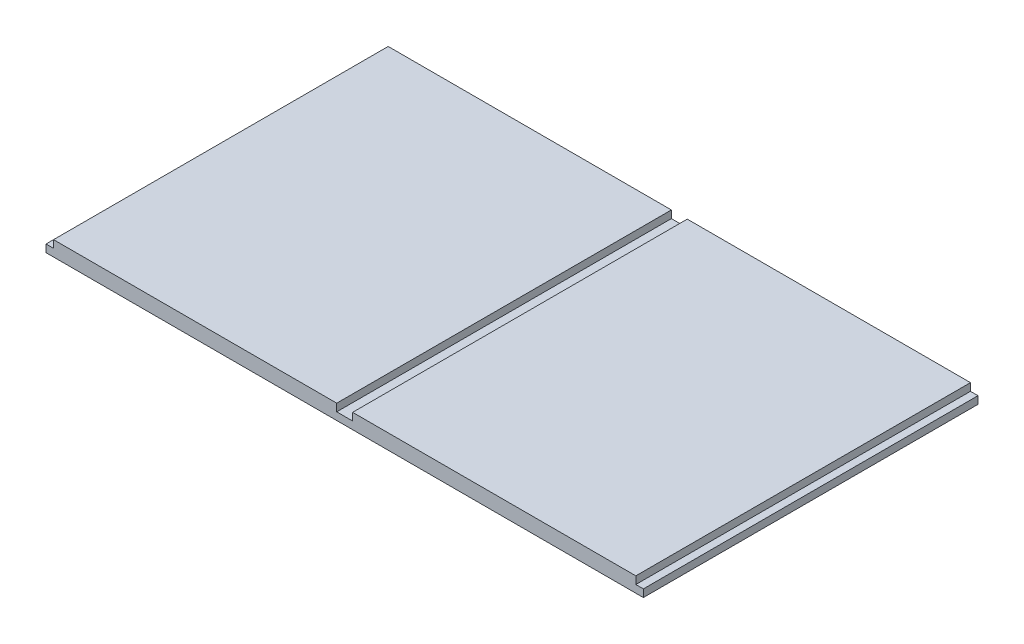
ISO-10303-21;
HEADER;
FILE_DESCRIPTION(('STEP AP214'),'2;1');
FILE_NAME('part.step','',(''),(''),'','','');
FILE_SCHEMA(('AUTOMOTIVE_DESIGN { 1 0 10303 214 1 1 1 1 }'));
ENDSEC;
DATA;
#1=APPLICATION_CONTEXT('core data for automotive mechanical design processes');
#2=APPLICATION_PROTOCOL_DEFINITION('international standard','automotive_design',2000,#1);
#3=PRODUCT_CONTEXT('',#1,'mechanical');
#4=PRODUCT('Part','Part','',(#3));
#5=PRODUCT_RELATED_PRODUCT_CATEGORY('part','',(#4));
#6=PRODUCT_DEFINITION_FORMATION('','',#4);
#7=PRODUCT_DEFINITION_CONTEXT('part definition',#1,'design');
#8=PRODUCT_DEFINITION('design','',#6,#7);
#9=PRODUCT_DEFINITION_SHAPE('','',#8);
#10=(LENGTH_UNIT() NAMED_UNIT(*) SI_UNIT(.MILLI.,.METRE.));
#11=(NAMED_UNIT(*) PLANE_ANGLE_UNIT() SI_UNIT($,.RADIAN.));
#12=(NAMED_UNIT(*) SI_UNIT($,.STERADIAN.) SOLID_ANGLE_UNIT());
#13=UNCERTAINTY_MEASURE_WITH_UNIT(LENGTH_MEASURE(1.E-05),#10,'distance_accuracy_value','');
#14=(GEOMETRIC_REPRESENTATION_CONTEXT(3) GLOBAL_UNCERTAINTY_ASSIGNED_CONTEXT((#13)) GLOBAL_UNIT_ASSIGNED_CONTEXT((#10,
#11,#12)) REPRESENTATION_CONTEXT('',''));
#15=CARTESIAN_POINT('',(0.,0.,0.));
#16=DIRECTION('',(0.,0.,1.));
#17=DIRECTION('',(1.,0.,0.));
#18=AXIS2_PLACEMENT_3D('',#15,#16,#17);
#19=CARTESIAN_POINT('',(0.,18.,0.));
#20=DIRECTION('',(0.,-1.,0.));
#21=DIRECTION('',(0.,0.,-1.));
#22=AXIS2_PLACEMENT_3D('',#19,#20,#21);
#23=PLANE('',#22);
#24=DIRECTION('',(-1.,0.,0.));
#25=VECTOR('',#24,1.);
#26=CARTESIAN_POINT('',(-357.,18.,-200.));
#27=LINE('',#26,#25);
#28=CARTESIAN_POINT('',(348.,18.,-200.));
#29=VERTEX_POINT('',#28);
#30=CARTESIAN_POINT('',(9.5,18.,-200.));
#31=VERTEX_POINT('',#30);
#32=EDGE_CURVE('E195',#29,#31,#27,.T.);
#33=ORIENTED_EDGE('',*,*,#32,.T.);
#34=DIRECTION('',(0.,0.,-1.));
#35=VECTOR('',#34,1.);
#36=CARTESIAN_POINT('',(9.5,18.,200.));
#37=LINE('',#36,#35);
#38=CARTESIAN_POINT('',(9.5,18.,200.));
#39=VERTEX_POINT('',#38);
#40=EDGE_CURVE('E129',#39,#31,#37,.T.);
#41=ORIENTED_EDGE('',*,*,#40,.F.);
#42=DIRECTION('',(1.,0.,0.));
#43=VECTOR('',#42,1.);
#44=CARTESIAN_POINT('',(-357.,18.,200.));
#45=LINE('',#44,#43);
#46=CARTESIAN_POINT('',(348.,18.,200.));
#47=VERTEX_POINT('',#46);
#48=EDGE_CURVE('E197',#39,#47,#45,.T.);
#49=ORIENTED_EDGE('',*,*,#48,.T.);
#50=DIRECTION('',(0.,0.,1.));
#51=VECTOR('',#50,1.);
#52=CARTESIAN_POINT('',(348.,18.,200.));
#53=LINE('',#52,#51);
#54=EDGE_CURVE('E164',#29,#47,#53,.T.);
#55=ORIENTED_EDGE('',*,*,#54,.F.);
#56=EDGE_LOOP('',(#33,#41,#49,#55));
#57=FACE_BOUND('',#56,.T.);
#58=ADVANCED_FACE('F35',(#57),#23,.F.);
#59=CARTESIAN_POINT('',(357.,18.,200.));
#60=DIRECTION('',(-1.,0.,0.));
#61=DIRECTION('',(0.,0.,1.));
#62=AXIS2_PLACEMENT_3D('',#59,#60,#61);
#63=PLANE('',#62);
#64=DIRECTION('',(0.,0.,-1.));
#65=VECTOR('',#64,1.);
#66=CARTESIAN_POINT('',(357.,9.,200.));
#67=LINE('',#66,#65);
#68=CARTESIAN_POINT('',(357.,9.,200.));
#69=VERTEX_POINT('',#68);
#70=CARTESIAN_POINT('',(357.,9.,-200.));
#71=VERTEX_POINT('',#70);
#72=EDGE_CURVE('E161',#69,#71,#67,.T.);
#73=ORIENTED_EDGE('',*,*,#72,.F.);
#74=DIRECTION('',(0.,-1.,0.));
#75=VECTOR('',#74,1.);
#76=CARTESIAN_POINT('',(357.,18.,200.));
#77=LINE('',#76,#75);
#78=CARTESIAN_POINT('',(357.,0.,200.));
#79=VERTEX_POINT('',#78);
#80=EDGE_CURVE('E202',#69,#79,#77,.T.);
#81=ORIENTED_EDGE('',*,*,#80,.T.);
#82=DIRECTION('',(0.,0.,-1.));
#83=VECTOR('',#82,1.);
#84=CARTESIAN_POINT('',(357.,0.,200.));
#85=LINE('',#84,#83);
#86=CARTESIAN_POINT('',(357.,0.,-200.));
#87=VERTEX_POINT('',#86);
#88=EDGE_CURVE('E179',#79,#87,#85,.T.);
#89=ORIENTED_EDGE('',*,*,#88,.T.);
#90=DIRECTION('',(0.,-1.,0.));
#91=VECTOR('',#90,1.);
#92=CARTESIAN_POINT('',(357.,18.,-200.));
#93=LINE('',#92,#91);
#94=EDGE_CURVE('E11',#71,#87,#93,.T.);
#95=ORIENTED_EDGE('',*,*,#94,.F.);
#96=EDGE_LOOP('',(#73,#81,#89,#95));
#97=FACE_BOUND('',#96,.T.);
#98=ADVANCED_FACE('F37',(#97),#63,.F.);
#99=CARTESIAN_POINT('',(-357.,18.,-200.));
#100=DIRECTION('',(0.,0.,1.));
#101=DIRECTION('',(1.,0.,0.));
#102=AXIS2_PLACEMENT_3D('',#99,#100,#101);
#103=PLANE('',#102);
#104=DIRECTION('',(-1.,0.,0.));
#105=VECTOR('',#104,1.);
#106=CARTESIAN_POINT('',(-9.5,9.,-200.));
#107=LINE('',#106,#105);
#108=CARTESIAN_POINT('',(9.5,9.,-200.));
#109=VERTEX_POINT('',#108);
#110=CARTESIAN_POINT('',(-9.5,9.,-200.));
#111=VERTEX_POINT('',#110);
#112=EDGE_CURVE('E140',#109,#111,#107,.T.);
#113=ORIENTED_EDGE('',*,*,#112,.F.);
#114=DIRECTION('',(0.,1.,0.));
#115=VECTOR('',#114,1.);
#116=CARTESIAN_POINT('',(9.5,9.,-200.));
#117=LINE('',#116,#115);
#118=EDGE_CURVE('E123',#109,#31,#117,.T.);
#119=ORIENTED_EDGE('',*,*,#118,.T.);
#120=ORIENTED_EDGE('',*,*,#32,.F.);
#121=DIRECTION('',(0.,1.,0.));
#122=VECTOR('',#121,1.);
#123=CARTESIAN_POINT('',(348.,9.,-200.));
#124=LINE('',#123,#122);
#125=CARTESIAN_POINT('',(348.,9.,-200.));
#126=VERTEX_POINT('',#125);
#127=EDGE_CURVE('E172',#126,#29,#124,.T.);
#128=ORIENTED_EDGE('',*,*,#127,.F.);
#129=DIRECTION('',(-1.,0.,0.));
#130=VECTOR('',#129,1.);
#131=CARTESIAN_POINT('',(357.,9.,-200.));
#132=LINE('',#131,#130);
#133=EDGE_CURVE('E163',#71,#126,#132,.T.);
#134=ORIENTED_EDGE('',*,*,#133,.F.);
#135=ORIENTED_EDGE('',*,*,#94,.T.);
#136=DIRECTION('',(-1.,0.,0.));
#137=VECTOR('',#136,1.);
#138=CARTESIAN_POINT('',(-357.,0.,-200.));
#139=LINE('',#138,#137);
#140=CARTESIAN_POINT('',(-357.,0.,-200.));
#141=VERTEX_POINT('',#140);
#142=EDGE_CURVE('E205',#87,#141,#139,.T.);
#143=ORIENTED_EDGE('',*,*,#142,.T.);
#144=DIRECTION('',(0.,-1.,0.));
#145=VECTOR('',#144,1.);
#146=CARTESIAN_POINT('',(-357.,18.,-200.));
#147=LINE('',#146,#145);
#148=CARTESIAN_POINT('',(-357.,9.,-200.));
#149=VERTEX_POINT('',#148);
#150=EDGE_CURVE('E43',#149,#141,#147,.T.);
#151=ORIENTED_EDGE('',*,*,#150,.F.);
#152=DIRECTION('',(-1.,0.,0.));
#153=VECTOR('',#152,1.);
#154=CARTESIAN_POINT('',(-357.,9.,-200.));
#155=LINE('',#154,#153);
#156=CARTESIAN_POINT('',(-348.,9.,-200.));
#157=VERTEX_POINT('',#156);
#158=EDGE_CURVE('E189',#157,#149,#155,.T.);
#159=ORIENTED_EDGE('',*,*,#158,.F.);
#160=DIRECTION('',(0.,1.,0.));
#161=VECTOR('',#160,1.);
#162=CARTESIAN_POINT('',(-348.,9.,-200.));
#163=LINE('',#162,#161);
#164=CARTESIAN_POINT('',(-348.,18.,-200.));
#165=VERTEX_POINT('',#164);
#166=EDGE_CURVE('E175',#157,#165,#163,.T.);
#167=ORIENTED_EDGE('',*,*,#166,.T.);
#168=CARTESIAN_POINT('',(-9.50000000000001,18.,-200.));
#169=VERTEX_POINT('',#168);
#170=EDGE_CURVE('E198',#169,#165,#27,.T.);
#171=ORIENTED_EDGE('',*,*,#170,.F.);
#172=DIRECTION('',(0.,1.,0.));
#173=VECTOR('',#172,1.);
#174=CARTESIAN_POINT('',(-9.5,9.,-200.));
#175=LINE('',#174,#173);
#176=EDGE_CURVE('E50',#111,#169,#175,.T.);
#177=ORIENTED_EDGE('',*,*,#176,.F.);
#178=EDGE_LOOP('',(#113,#119,#120,#128,#134,#135,#143,#151,#159,#167,#171,#177));
#179=FACE_BOUND('',#178,.T.);
#180=ADVANCED_FACE('F145',(#179),#103,.F.);
#181=CARTESIAN_POINT('',(-357.,18.,200.));
#182=DIRECTION('',(1.,0.,0.));
#183=DIRECTION('',(0.,0.,-1.));
#184=AXIS2_PLACEMENT_3D('',#181,#182,#183);
#185=PLANE('',#184);
#186=DIRECTION('',(0.,-1.,0.));
#187=VECTOR('',#186,1.);
#188=CARTESIAN_POINT('',(-357.,18.,200.));
#189=LINE('',#188,#187);
#190=CARTESIAN_POINT('',(-357.,9.,200.));
#191=VERTEX_POINT('',#190);
#192=CARTESIAN_POINT('',(-357.,0.,200.));
#193=VERTEX_POINT('',#192);
#194=EDGE_CURVE('E215',#191,#193,#189,.T.);
#195=ORIENTED_EDGE('',*,*,#194,.F.);
#196=DIRECTION('',(0.,0.,1.));
#197=VECTOR('',#196,1.);
#198=CARTESIAN_POINT('',(-357.,9.,200.));
#199=LINE('',#198,#197);
#200=EDGE_CURVE('E181',#149,#191,#199,.T.);
#201=ORIENTED_EDGE('',*,*,#200,.F.);
#202=ORIENTED_EDGE('',*,*,#150,.T.);
#203=DIRECTION('',(0.,0.,1.));
#204=VECTOR('',#203,1.);
#205=CARTESIAN_POINT('',(-357.,0.,200.));
#206=LINE('',#205,#204);
#207=EDGE_CURVE('E208',#141,#193,#206,.T.);
#208=ORIENTED_EDGE('',*,*,#207,.T.);
#209=EDGE_LOOP('',(#195,#201,#202,#208));
#210=FACE_BOUND('',#209,.T.);
#211=ADVANCED_FACE('F220',(#210),#185,.F.);
#212=CARTESIAN_POINT('',(-357.,18.,200.));
#213=DIRECTION('',(0.,0.,-1.));
#214=DIRECTION('',(-1.,0.,0.));
#215=AXIS2_PLACEMENT_3D('',#212,#213,#214);
#216=PLANE('',#215);
#217=ORIENTED_EDGE('',*,*,#48,.F.);
#218=DIRECTION('',(0.,1.,0.));
#219=VECTOR('',#218,1.);
#220=CARTESIAN_POINT('',(9.5,9.,200.));
#221=LINE('',#220,#219);
#222=CARTESIAN_POINT('',(9.5,9.,200.));
#223=VERTEX_POINT('',#222);
#224=EDGE_CURVE('E154',#223,#39,#221,.T.);
#225=ORIENTED_EDGE('',*,*,#224,.F.);
#226=DIRECTION('',(1.,0.,0.));
#227=VECTOR('',#226,1.);
#228=CARTESIAN_POINT('',(-9.5,9.,200.));
#229=LINE('',#228,#227);
#230=CARTESIAN_POINT('',(-9.5,9.,200.));
#231=VERTEX_POINT('',#230);
#232=EDGE_CURVE('E134',#231,#223,#229,.T.);
#233=ORIENTED_EDGE('',*,*,#232,.F.);
#234=DIRECTION('',(0.,1.,0.));
#235=VECTOR('',#234,1.);
#236=CARTESIAN_POINT('',(-9.5,9.,200.));
#237=LINE('',#236,#235);
#238=CARTESIAN_POINT('',(-9.5,18.,200.));
#239=VERTEX_POINT('',#238);
#240=EDGE_CURVE('E157',#231,#239,#237,.T.);
#241=ORIENTED_EDGE('',*,*,#240,.T.);
#242=CARTESIAN_POINT('',(-348.,18.,200.));
#243=VERTEX_POINT('',#242);
#244=EDGE_CURVE('E199',#243,#239,#45,.T.);
#245=ORIENTED_EDGE('',*,*,#244,.F.);
#246=DIRECTION('',(0.,1.,0.));
#247=VECTOR('',#246,1.);
#248=CARTESIAN_POINT('',(-348.,9.,200.));
#249=LINE('',#248,#247);
#250=CARTESIAN_POINT('',(-348.,9.,200.));
#251=VERTEX_POINT('',#250);
#252=EDGE_CURVE('E58',#251,#243,#249,.T.);
#253=ORIENTED_EDGE('',*,*,#252,.F.);
#254=DIRECTION('',(1.,0.,0.));
#255=VECTOR('',#254,1.);
#256=CARTESIAN_POINT('',(-357.,9.,200.));
#257=LINE('',#256,#255);
#258=EDGE_CURVE('E183',#191,#251,#257,.T.);
#259=ORIENTED_EDGE('',*,*,#258,.F.);
#260=ORIENTED_EDGE('',*,*,#194,.T.);
#261=DIRECTION('',(1.,0.,0.));
#262=VECTOR('',#261,1.);
#263=CARTESIAN_POINT('',(-357.,0.,200.));
#264=LINE('',#263,#262);
#265=EDGE_CURVE('E211',#193,#79,#264,.T.);
#266=ORIENTED_EDGE('',*,*,#265,.T.);
#267=ORIENTED_EDGE('',*,*,#80,.F.);
#268=DIRECTION('',(1.,0.,0.));
#269=VECTOR('',#268,1.);
#270=CARTESIAN_POINT('',(357.,9.,200.));
#271=LINE('',#270,#269);
#272=CARTESIAN_POINT('',(348.,9.,200.));
#273=VERTEX_POINT('',#272);
#274=EDGE_CURVE('E170',#273,#69,#271,.T.);
#275=ORIENTED_EDGE('',*,*,#274,.F.);
#276=DIRECTION('',(0.,1.,0.));
#277=VECTOR('',#276,1.);
#278=CARTESIAN_POINT('',(348.,9.,200.));
#279=LINE('',#278,#277);
#280=EDGE_CURVE('E176',#273,#47,#279,.T.);
#281=ORIENTED_EDGE('',*,*,#280,.T.);
#282=EDGE_LOOP('',(#217,#225,#233,#241,#245,#253,#259,#260,#266,#267,#275,#281));
#283=FACE_BOUND('',#282,.T.);
#284=ADVANCED_FACE('F233',(#283),#216,.F.);
#285=ORIENTED_EDGE('',*,*,#244,.T.);
#286=DIRECTION('',(0.,0.,1.));
#287=VECTOR('',#286,1.);
#288=CARTESIAN_POINT('',(-9.5,18.,200.));
#289=LINE('',#288,#287);
#290=EDGE_CURVE('E143',#169,#239,#289,.T.);
#291=ORIENTED_EDGE('',*,*,#290,.F.);
#292=ORIENTED_EDGE('',*,*,#170,.T.);
#293=DIRECTION('',(0.,0.,-1.));
#294=VECTOR('',#293,1.);
#295=CARTESIAN_POINT('',(-348.,18.,200.));
#296=LINE('',#295,#294);
#297=EDGE_CURVE('E156',#243,#165,#296,.T.);
#298=ORIENTED_EDGE('',*,*,#297,.F.);
#299=EDGE_LOOP('',(#285,#291,#292,#298));
#300=FACE_BOUND('',#299,.T.);
#301=ADVANCED_FACE('F241',(#300),#23,.F.);
#302=CARTESIAN_POINT('',(0.,0.,0.));
#303=DIRECTION('',(0.,-1.,0.));
#304=DIRECTION('',(0.,0.,-1.));
#305=AXIS2_PLACEMENT_3D('',#302,#303,#304);
#306=PLANE('',#305);
#307=ORIENTED_EDGE('',*,*,#88,.F.);
#308=ORIENTED_EDGE('',*,*,#265,.F.);
#309=ORIENTED_EDGE('',*,*,#207,.F.);
#310=ORIENTED_EDGE('',*,*,#142,.F.);
#311=EDGE_LOOP('',(#307,#308,#309,#310));
#312=FACE_BOUND('',#311,.T.);
#313=ADVANCED_FACE('F229',(#312),#306,.T.);
#314=CARTESIAN_POINT('',(-348.,9.,200.));
#315=DIRECTION('',(1.,0.,0.));
#316=DIRECTION('',(0.,0.,-1.));
#317=AXIS2_PLACEMENT_3D('',#314,#315,#316);
#318=PLANE('',#317);
#319=ORIENTED_EDGE('',*,*,#297,.T.);
#320=ORIENTED_EDGE('',*,*,#166,.F.);
#321=DIRECTION('',(0.,0.,-1.));
#322=VECTOR('',#321,1.);
#323=CARTESIAN_POINT('',(-348.,9.,200.));
#324=LINE('',#323,#322);
#325=EDGE_CURVE('E186',#251,#157,#324,.T.);
#326=ORIENTED_EDGE('',*,*,#325,.F.);
#327=ORIENTED_EDGE('',*,*,#252,.T.);
#328=EDGE_LOOP('',(#319,#320,#326,#327));
#329=FACE_BOUND('',#328,.T.);
#330=ADVANCED_FACE('F239',(#329),#318,.F.);
#331=CARTESIAN_POINT('',(0.,9.,0.));
#332=DIRECTION('',(0.,-1.,0.));
#333=DIRECTION('',(0.,0.,-1.));
#334=AXIS2_PLACEMENT_3D('',#331,#332,#333);
#335=PLANE('',#334);
#336=ORIENTED_EDGE('',*,*,#200,.T.);
#337=ORIENTED_EDGE('',*,*,#258,.T.);
#338=ORIENTED_EDGE('',*,*,#325,.T.);
#339=ORIENTED_EDGE('',*,*,#158,.T.);
#340=EDGE_LOOP('',(#336,#337,#338,#339));
#341=FACE_BOUND('',#340,.T.);
#342=ADVANCED_FACE('F238',(#341),#335,.F.);
#343=CARTESIAN_POINT('',(348.,9.,200.));
#344=DIRECTION('',(-1.,0.,0.));
#345=DIRECTION('',(0.,0.,1.));
#346=AXIS2_PLACEMENT_3D('',#343,#344,#345);
#347=PLANE('',#346);
#348=ORIENTED_EDGE('',*,*,#54,.T.);
#349=ORIENTED_EDGE('',*,*,#280,.F.);
#350=DIRECTION('',(0.,0.,1.));
#351=VECTOR('',#350,1.);
#352=CARTESIAN_POINT('',(348.,9.,200.));
#353=LINE('',#352,#351);
#354=EDGE_CURVE('E167',#126,#273,#353,.T.);
#355=ORIENTED_EDGE('',*,*,#354,.F.);
#356=ORIENTED_EDGE('',*,*,#127,.T.);
#357=EDGE_LOOP('',(#348,#349,#355,#356));
#358=FACE_BOUND('',#357,.T.);
#359=ADVANCED_FACE('F300',(#358),#347,.F.);
#360=CARTESIAN_POINT('',(0.,9.,0.));
#361=DIRECTION('',(0.,1.,0.));
#362=DIRECTION('',(0.,0.,1.));
#363=AXIS2_PLACEMENT_3D('',#360,#361,#362);
#364=PLANE('',#363);
#365=ORIENTED_EDGE('',*,*,#72,.T.);
#366=ORIENTED_EDGE('',*,*,#133,.T.);
#367=ORIENTED_EDGE('',*,*,#354,.T.);
#368=ORIENTED_EDGE('',*,*,#274,.T.);
#369=EDGE_LOOP('',(#365,#366,#367,#368));
#370=FACE_BOUND('',#369,.T.);
#371=ADVANCED_FACE('F250',(#370),#364,.T.);
#372=CARTESIAN_POINT('',(9.5,9.,200.));
#373=DIRECTION('',(1.,0.,0.));
#374=DIRECTION('',(0.,0.,-1.));
#375=AXIS2_PLACEMENT_3D('',#372,#373,#374);
#376=PLANE('',#375);
#377=ORIENTED_EDGE('',*,*,#40,.T.);
#378=ORIENTED_EDGE('',*,*,#118,.F.);
#379=DIRECTION('',(0.,0.,-1.));
#380=VECTOR('',#379,1.);
#381=CARTESIAN_POINT('',(9.5,9.,200.));
#382=LINE('',#381,#380);
#383=EDGE_CURVE('E126',#223,#109,#382,.T.);
#384=ORIENTED_EDGE('',*,*,#383,.F.);
#385=ORIENTED_EDGE('',*,*,#224,.T.);
#386=EDGE_LOOP('',(#377,#378,#384,#385));
#387=FACE_BOUND('',#386,.T.);
#388=ADVANCED_FACE('F125',(#387),#376,.F.);
#389=CARTESIAN_POINT('',(-9.5,9.,200.));
#390=DIRECTION('',(-1.,0.,0.));
#391=DIRECTION('',(0.,0.,1.));
#392=AXIS2_PLACEMENT_3D('',#389,#390,#391);
#393=PLANE('',#392);
#394=ORIENTED_EDGE('',*,*,#290,.T.);
#395=ORIENTED_EDGE('',*,*,#240,.F.);
#396=DIRECTION('',(0.,0.,1.));
#397=VECTOR('',#396,1.);
#398=CARTESIAN_POINT('',(-9.5,9.,200.));
#399=LINE('',#398,#397);
#400=EDGE_CURVE('E147',#111,#231,#399,.T.);
#401=ORIENTED_EDGE('',*,*,#400,.F.);
#402=ORIENTED_EDGE('',*,*,#176,.T.);
#403=EDGE_LOOP('',(#394,#395,#401,#402));
#404=FACE_BOUND('',#403,.T.);
#405=ADVANCED_FACE('F242',(#404),#393,.F.);
#406=CARTESIAN_POINT('',(0.,9.,0.));
#407=DIRECTION('',(0.,-1.,0.));
#408=DIRECTION('',(0.,0.,-1.));
#409=AXIS2_PLACEMENT_3D('',#406,#407,#408);
#410=PLANE('',#409);
#411=ORIENTED_EDGE('',*,*,#383,.T.);
#412=ORIENTED_EDGE('',*,*,#112,.T.);
#413=ORIENTED_EDGE('',*,*,#400,.T.);
#414=ORIENTED_EDGE('',*,*,#232,.T.);
#415=EDGE_LOOP('',(#411,#412,#413,#414));
#416=FACE_BOUND('',#415,.T.);
#417=ADVANCED_FACE('F138',(#416),#410,.F.);
#418=CLOSED_SHELL('',(#58,#98,#180,#211,#284,#301,#313,#330,#342,#359,#371,#388,#405,#417));
#419=MANIFOLD_SOLID_BREP('B2',#418);
#420=ADVANCED_BREP_SHAPE_REPRESENTATION('',(#18,#419),#14);
#421=SHAPE_DEFINITION_REPRESENTATION(#9,#420);
ENDSEC;
END-ISO-10303-21;
